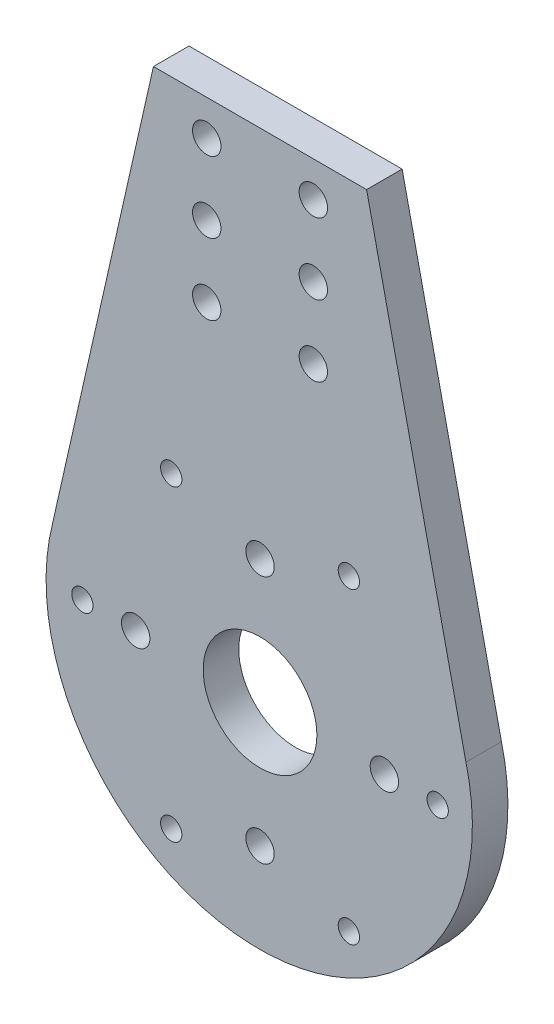
ISO-10303-21;
HEADER;
FILE_DESCRIPTION(('STEP AP214'),'2;1');
FILE_NAME('part.step','',(''),(''),'','','');
FILE_SCHEMA(('AUTOMOTIVE_DESIGN { 1 0 10303 214 1 1 1 1 }'));
ENDSEC;
DATA;
#1=APPLICATION_CONTEXT('core data for automotive mechanical design processes');
#2=APPLICATION_PROTOCOL_DEFINITION('international standard','automotive_design',2000,#1);
#3=PRODUCT_CONTEXT('',#1,'mechanical');
#4=PRODUCT('Part','Part','',(#3));
#5=PRODUCT_RELATED_PRODUCT_CATEGORY('part','',(#4));
#6=PRODUCT_DEFINITION_FORMATION('','',#4);
#7=PRODUCT_DEFINITION_CONTEXT('part definition',#1,'design');
#8=PRODUCT_DEFINITION('design','',#6,#7);
#9=PRODUCT_DEFINITION_SHAPE('','',#8);
#10=(LENGTH_UNIT() NAMED_UNIT(*) SI_UNIT(.MILLI.,.METRE.));
#11=(NAMED_UNIT(*) PLANE_ANGLE_UNIT() SI_UNIT($,.RADIAN.));
#12=(NAMED_UNIT(*) SI_UNIT($,.STERADIAN.) SOLID_ANGLE_UNIT());
#13=UNCERTAINTY_MEASURE_WITH_UNIT(LENGTH_MEASURE(1.E-05),#10,'distance_accuracy_value','');
#14=(GEOMETRIC_REPRESENTATION_CONTEXT(3) GLOBAL_UNCERTAINTY_ASSIGNED_CONTEXT((#13)) GLOBAL_UNIT_ASSIGNED_CONTEXT((#10,
#11,#12)) REPRESENTATION_CONTEXT('',''));
#15=CARTESIAN_POINT('',(0.,0.,0.));
#16=DIRECTION('',(0.,0.,1.));
#17=DIRECTION('',(1.,0.,0.));
#18=AXIS2_PLACEMENT_3D('',#15,#16,#17);
#19=CARTESIAN_POINT('',(-29.3302083690951,6.63290634270247,5.));
#20=DIRECTION('',(0.975369816698412,-0.220575884161679,0.));
#21=DIRECTION('',(0.220575884161679,0.975369816698412,0.));
#22=AXIS2_PLACEMENT_3D('',#19,#20,#21);
#23=PLANE('',#22);
#24=DIRECTION('',(-0.220575884161679,-0.975369816698412,0.));
#25=VECTOR('',#24,1.);
#26=CARTESIAN_POINT('',(-29.3302083690951,6.63290634270247,0.));
#27=LINE('',#26,#25);
#28=CARTESIAN_POINT('',(-15.,70.,0.));
#29=VERTEX_POINT('',#28);
#30=CARTESIAN_POINT('',(-29.2030837399599,7.1950418031983,0.));
#31=VERTEX_POINT('',#30);
#32=EDGE_CURVE('E152',#29,#31,#27,.T.);
#33=ORIENTED_EDGE('',*,*,#32,.T.);
#34=DIRECTION('',(0.,0.,-1.));
#35=VECTOR('',#34,1.);
#36=CARTESIAN_POINT('',(-29.2030837399599,7.1950418031983,5.));
#37=LINE('',#36,#35);
#38=CARTESIAN_POINT('',(-29.2030837399599,7.1950418031983,5.));
#39=VERTEX_POINT('',#38);
#40=EDGE_CURVE('E11',#39,#31,#37,.T.);
#41=ORIENTED_EDGE('',*,*,#40,.F.);
#42=DIRECTION('',(-0.220575884161679,-0.975369816698412,0.));
#43=VECTOR('',#42,1.);
#44=CARTESIAN_POINT('',(-29.3302083690951,6.63290634270247,5.));
#45=LINE('',#44,#43);
#46=CARTESIAN_POINT('',(-15.,70.,5.));
#47=VERTEX_POINT('',#46);
#48=EDGE_CURVE('E87',#47,#39,#45,.T.);
#49=ORIENTED_EDGE('',*,*,#48,.F.);
#50=DIRECTION('',(0.,0.,-1.));
#51=VECTOR('',#50,1.);
#52=CARTESIAN_POINT('',(-15.,70.,5.));
#53=LINE('',#52,#51);
#54=EDGE_CURVE('E53',#47,#29,#53,.T.);
#55=ORIENTED_EDGE('',*,*,#54,.T.);
#56=EDGE_LOOP('',(#33,#41,#49,#55));
#57=FACE_BOUND('',#56,.T.);
#58=ADVANCED_FACE('F37',(#57),#23,.F.);
#59=CARTESIAN_POINT('',(-0.11273470883566,-0.136506003872943,5.));
#60=DIRECTION('',(0.,0.,-1.));
#61=DIRECTION('',(-1.,0.,0.));
#62=AXIS2_PLACEMENT_3D('',#59,#60,#61);
#63=CYLINDRICAL_SURFACE('',#62,30.);
#64=CARTESIAN_POINT('',(-0.11273470883566,-0.136506003872943,0.));
#65=DIRECTION('',(0.,0.,1.));
#66=DIRECTION('',(1.,0.,0.));
#67=AXIS2_PLACEMENT_3D('',#64,#65,#66);
#68=CIRCLE('',#67,30.);
#69=CARTESIAN_POINT('',(28.9776143222885,7.1950418031983,0.));
#70=VERTEX_POINT('',#69);
#71=EDGE_CURVE('E92',#31,#70,#68,.T.);
#72=ORIENTED_EDGE('',*,*,#71,.T.);
#73=DIRECTION('',(0.,0.,-1.));
#74=VECTOR('',#73,1.);
#75=CARTESIAN_POINT('',(28.9776143222885,7.1950418031983,5.));
#76=LINE('',#75,#74);
#77=CARTESIAN_POINT('',(28.9776143222885,7.1950418031983,5.));
#78=VERTEX_POINT('',#77);
#79=EDGE_CURVE('E45',#78,#70,#76,.T.);
#80=ORIENTED_EDGE('',*,*,#79,.F.);
#81=CARTESIAN_POINT('',(-0.11273470883566,-0.136506003872943,5.));
#82=DIRECTION('',(0.,0.,1.));
#83=DIRECTION('',(1.,0.,0.));
#84=AXIS2_PLACEMENT_3D('',#81,#82,#83);
#85=CIRCLE('',#84,30.);
#86=EDGE_CURVE('E78',#39,#78,#85,.T.);
#87=ORIENTED_EDGE('',*,*,#86,.F.);
#88=ORIENTED_EDGE('',*,*,#40,.T.);
#89=EDGE_LOOP('',(#72,#80,#87,#88));
#90=FACE_BOUND('',#89,.T.);
#91=ADVANCED_FACE('F91',(#90),#63,.T.);
#92=CARTESIAN_POINT('',(29.1357849827705,6.48434100043762,5.));
#93=DIRECTION('',(0.976118036116227,0.217240833106026,0.));
#94=DIRECTION('',(-0.217240833106026,0.976118036116227,0.));
#95=AXIS2_PLACEMENT_3D('',#92,#93,#94);
#96=PLANE('',#95);
#97=DIRECTION('',(0.217240833106026,-0.976118036116227,0.));
#98=VECTOR('',#97,1.);
#99=CARTESIAN_POINT('',(29.1357849827705,6.48434100043762,0.));
#100=LINE('',#99,#98);
#101=CARTESIAN_POINT('',(15.,70.,0.));
#102=VERTEX_POINT('',#101);
#103=EDGE_CURVE('E155',#102,#70,#100,.T.);
#104=ORIENTED_EDGE('',*,*,#103,.F.);
#105=DIRECTION('',(0.,0.,-1.));
#106=VECTOR('',#105,1.);
#107=CARTESIAN_POINT('',(15.,70.,5.));
#108=LINE('',#107,#106);
#109=CARTESIAN_POINT('',(15.,70.,5.));
#110=VERTEX_POINT('',#109);
#111=EDGE_CURVE('E67',#110,#102,#108,.T.);
#112=ORIENTED_EDGE('',*,*,#111,.F.);
#113=DIRECTION('',(0.217240833106026,-0.976118036116227,0.));
#114=VECTOR('',#113,1.);
#115=CARTESIAN_POINT('',(29.1357849827705,6.48434100043762,5.));
#116=LINE('',#115,#114);
#117=EDGE_CURVE('E86',#110,#78,#116,.T.);
#118=ORIENTED_EDGE('',*,*,#117,.T.);
#119=ORIENTED_EDGE('',*,*,#79,.T.);
#120=EDGE_LOOP('',(#104,#112,#118,#119));
#121=FACE_BOUND('',#120,.T.);
#122=ADVANCED_FACE('F95',(#121),#96,.T.);
#123=CARTESIAN_POINT('',(12.4999999999999,21.650635094611,5.));
#124=DIRECTION('',(0.,0.,-1.));
#125=DIRECTION('',(-1.,0.,0.));
#126=AXIS2_PLACEMENT_3D('',#123,#124,#125);
#127=CYLINDRICAL_SURFACE('',#126,1.5);
#128=CARTESIAN_POINT('',(12.4999999999999,21.650635094611,5.));
#129=DIRECTION('',(0.,0.,1.));
#130=DIRECTION('',(1.,0.,0.));
#131=AXIS2_PLACEMENT_3D('',#128,#129,#130);
#132=CIRCLE('',#131,1.5);
#133=CARTESIAN_POINT('',(14.,21.650635094611,5.));
#134=VERTEX_POINT('',#133);
#135=EDGE_CURVE('E146',#134,#134,#132,.T.);
#136=ORIENTED_EDGE('',*,*,#135,.T.);
#137=EDGE_LOOP('',(#136));
#138=FACE_BOUND('',#137,.T.);
#139=CARTESIAN_POINT('',(12.4999999999999,21.650635094611,0.));
#140=DIRECTION('',(0.,0.,1.));
#141=DIRECTION('',(1.,0.,0.));
#142=AXIS2_PLACEMENT_3D('',#139,#140,#141);
#143=CIRCLE('',#142,1.5);
#144=CARTESIAN_POINT('',(14.,21.650635094611,0.));
#145=VERTEX_POINT('',#144);
#146=EDGE_CURVE('E205',#145,#145,#143,.T.);
#147=ORIENTED_EDGE('',*,*,#146,.F.);
#148=EDGE_LOOP('',(#147));
#149=FACE_BOUND('',#148,.T.);
#150=ADVANCED_FACE('F269',(#138,#149),#127,.F.);
#151=CARTESIAN_POINT('',(-12.5000000000001,21.6506350946109,5.));
#152=DIRECTION('',(0.,0.,-1.));
#153=DIRECTION('',(-1.,0.,0.));
#154=AXIS2_PLACEMENT_3D('',#151,#152,#153);
#155=CYLINDRICAL_SURFACE('',#154,1.5);
#156=CARTESIAN_POINT('',(-12.5000000000001,21.6506350946109,5.));
#157=DIRECTION('',(0.,0.,1.));
#158=DIRECTION('',(1.,0.,0.));
#159=AXIS2_PLACEMENT_3D('',#156,#157,#158);
#160=CIRCLE('',#159,1.5);
#161=CARTESIAN_POINT('',(-11.0000000000001,21.6506350946109,5.));
#162=VERTEX_POINT('',#161);
#163=EDGE_CURVE('E143',#162,#162,#160,.T.);
#164=ORIENTED_EDGE('',*,*,#163,.T.);
#165=EDGE_LOOP('',(#164));
#166=FACE_BOUND('',#165,.T.);
#167=CARTESIAN_POINT('',(-12.5000000000001,21.6506350946109,0.));
#168=DIRECTION('',(0.,0.,1.));
#169=DIRECTION('',(1.,0.,0.));
#170=AXIS2_PLACEMENT_3D('',#167,#168,#169);
#171=CIRCLE('',#170,1.5);
#172=CARTESIAN_POINT('',(-11.0000000000001,21.6506350946109,0.));
#173=VERTEX_POINT('',#172);
#174=EDGE_CURVE('E202',#173,#173,#171,.T.);
#175=ORIENTED_EDGE('',*,*,#174,.F.);
#176=EDGE_LOOP('',(#175));
#177=FACE_BOUND('',#176,.T.);
#178=ADVANCED_FACE('F271',(#166,#177),#155,.F.);
#179=CARTESIAN_POINT('',(-25.,0.,5.));
#180=DIRECTION('',(0.,0.,-1.));
#181=DIRECTION('',(-1.,0.,0.));
#182=AXIS2_PLACEMENT_3D('',#179,#180,#181);
#183=CYLINDRICAL_SURFACE('',#182,1.5);
#184=CARTESIAN_POINT('',(-25.,0.,5.));
#185=DIRECTION('',(0.,0.,1.));
#186=DIRECTION('',(1.,0.,0.));
#187=AXIS2_PLACEMENT_3D('',#184,#185,#186);
#188=CIRCLE('',#187,1.5);
#189=CARTESIAN_POINT('',(-23.5,0.,5.));
#190=VERTEX_POINT('',#189);
#191=EDGE_CURVE('E140',#190,#190,#188,.T.);
#192=ORIENTED_EDGE('',*,*,#191,.T.);
#193=EDGE_LOOP('',(#192));
#194=FACE_BOUND('',#193,.T.);
#195=CARTESIAN_POINT('',(-25.,0.,0.));
#196=DIRECTION('',(0.,0.,1.));
#197=DIRECTION('',(1.,0.,0.));
#198=AXIS2_PLACEMENT_3D('',#195,#196,#197);
#199=CIRCLE('',#198,1.5);
#200=CARTESIAN_POINT('',(-23.5,0.,0.));
#201=VERTEX_POINT('',#200);
#202=EDGE_CURVE('E199',#201,#201,#199,.T.);
#203=ORIENTED_EDGE('',*,*,#202,.F.);
#204=EDGE_LOOP('',(#203));
#205=FACE_BOUND('',#204,.T.);
#206=ADVANCED_FACE('F277',(#194,#205),#183,.F.);
#207=CARTESIAN_POINT('',(-12.4999999999999,-21.650635094611,5.));
#208=DIRECTION('',(0.,0.,-1.));
#209=DIRECTION('',(-1.,0.,0.));
#210=AXIS2_PLACEMENT_3D('',#207,#208,#209);
#211=CYLINDRICAL_SURFACE('',#210,1.5);
#212=CARTESIAN_POINT('',(-12.4999999999999,-21.650635094611,5.));
#213=DIRECTION('',(0.,0.,1.));
#214=DIRECTION('',(1.,0.,0.));
#215=AXIS2_PLACEMENT_3D('',#212,#213,#214);
#216=CIRCLE('',#215,1.5);
#217=CARTESIAN_POINT('',(-10.9999999999999,-21.650635094611,5.));
#218=VERTEX_POINT('',#217);
#219=EDGE_CURVE('E137',#218,#218,#216,.T.);
#220=ORIENTED_EDGE('',*,*,#219,.T.);
#221=EDGE_LOOP('',(#220));
#222=FACE_BOUND('',#221,.T.);
#223=CARTESIAN_POINT('',(-12.4999999999999,-21.650635094611,0.));
#224=DIRECTION('',(0.,0.,1.));
#225=DIRECTION('',(1.,0.,0.));
#226=AXIS2_PLACEMENT_3D('',#223,#224,#225);
#227=CIRCLE('',#226,1.5);
#228=CARTESIAN_POINT('',(-10.9999999999999,-21.650635094611,0.));
#229=VERTEX_POINT('',#228);
#230=EDGE_CURVE('E196',#229,#229,#227,.T.);
#231=ORIENTED_EDGE('',*,*,#230,.F.);
#232=EDGE_LOOP('',(#231));
#233=FACE_BOUND('',#232,.T.);
#234=ADVANCED_FACE('F284',(#222,#233),#211,.F.);
#235=CARTESIAN_POINT('',(12.5000000000001,-21.6506350946109,5.));
#236=DIRECTION('',(0.,0.,-1.));
#237=DIRECTION('',(-1.,0.,0.));
#238=AXIS2_PLACEMENT_3D('',#235,#236,#237);
#239=CYLINDRICAL_SURFACE('',#238,1.5);
#240=CARTESIAN_POINT('',(12.5000000000001,-21.6506350946109,5.));
#241=DIRECTION('',(0.,0.,1.));
#242=DIRECTION('',(1.,0.,0.));
#243=AXIS2_PLACEMENT_3D('',#240,#241,#242);
#244=CIRCLE('',#243,1.5);
#245=CARTESIAN_POINT('',(14.0000000000001,-21.6506350946109,5.));
#246=VERTEX_POINT('',#245);
#247=EDGE_CURVE('E134',#246,#246,#244,.T.);
#248=ORIENTED_EDGE('',*,*,#247,.T.);
#249=EDGE_LOOP('',(#248));
#250=FACE_BOUND('',#249,.T.);
#251=CARTESIAN_POINT('',(12.5000000000001,-21.6506350946109,0.));
#252=DIRECTION('',(0.,0.,1.));
#253=DIRECTION('',(1.,0.,0.));
#254=AXIS2_PLACEMENT_3D('',#251,#252,#253);
#255=CIRCLE('',#254,1.5);
#256=CARTESIAN_POINT('',(14.0000000000001,-21.6506350946109,0.));
#257=VERTEX_POINT('',#256);
#258=EDGE_CURVE('E193',#257,#257,#255,.T.);
#259=ORIENTED_EDGE('',*,*,#258,.F.);
#260=EDGE_LOOP('',(#259));
#261=FACE_BOUND('',#260,.T.);
#262=ADVANCED_FACE('F288',(#250,#261),#239,.F.);
#263=CARTESIAN_POINT('',(0.,0.,5.));
#264=DIRECTION('',(0.,0.,-1.));
#265=DIRECTION('',(-1.,0.,0.));
#266=AXIS2_PLACEMENT_3D('',#263,#264,#265);
#267=CYLINDRICAL_SURFACE('',#266,8.);
#268=CARTESIAN_POINT('',(0.,0.,5.));
#269=DIRECTION('',(0.,0.,1.));
#270=DIRECTION('',(1.,0.,0.));
#271=AXIS2_PLACEMENT_3D('',#268,#269,#270);
#272=CIRCLE('',#271,8.);
#273=CARTESIAN_POINT('',(8.,0.,5.));
#274=VERTEX_POINT('',#273);
#275=EDGE_CURVE('E131',#274,#274,#272,.T.);
#276=ORIENTED_EDGE('',*,*,#275,.T.);
#277=EDGE_LOOP('',(#276));
#278=FACE_BOUND('',#277,.T.);
#279=CARTESIAN_POINT('',(0.,0.,0.));
#280=DIRECTION('',(0.,0.,1.));
#281=DIRECTION('',(1.,0.,0.));
#282=AXIS2_PLACEMENT_3D('',#279,#280,#281);
#283=CIRCLE('',#282,8.);
#284=CARTESIAN_POINT('',(8.,0.,0.));
#285=VERTEX_POINT('',#284);
#286=EDGE_CURVE('E190',#285,#285,#283,.T.);
#287=ORIENTED_EDGE('',*,*,#286,.F.);
#288=EDGE_LOOP('',(#287));
#289=FACE_BOUND('',#288,.T.);
#290=ADVANCED_FACE('F292',(#278,#289),#267,.F.);
#291=CARTESIAN_POINT('',(0.,17.5,5.));
#292=DIRECTION('',(0.,0.,-1.));
#293=DIRECTION('',(-1.,0.,0.));
#294=AXIS2_PLACEMENT_3D('',#291,#292,#293);
#295=CYLINDRICAL_SURFACE('',#294,2.);
#296=CARTESIAN_POINT('',(0.,17.5,5.));
#297=DIRECTION('',(0.,0.,1.));
#298=DIRECTION('',(1.,0.,0.));
#299=AXIS2_PLACEMENT_3D('',#296,#297,#298);
#300=CIRCLE('',#299,2.);
#301=CARTESIAN_POINT('',(2.,17.5,5.));
#302=VERTEX_POINT('',#301);
#303=EDGE_CURVE('E128',#302,#302,#300,.T.);
#304=ORIENTED_EDGE('',*,*,#303,.T.);
#305=EDGE_LOOP('',(#304));
#306=FACE_BOUND('',#305,.T.);
#307=CARTESIAN_POINT('',(0.,17.5,0.));
#308=DIRECTION('',(0.,0.,1.));
#309=DIRECTION('',(1.,0.,0.));
#310=AXIS2_PLACEMENT_3D('',#307,#308,#309);
#311=CIRCLE('',#310,2.);
#312=CARTESIAN_POINT('',(2.,17.5,0.));
#313=VERTEX_POINT('',#312);
#314=EDGE_CURVE('E187',#313,#313,#311,.T.);
#315=ORIENTED_EDGE('',*,*,#314,.F.);
#316=EDGE_LOOP('',(#315));
#317=FACE_BOUND('',#316,.T.);
#318=ADVANCED_FACE('F296',(#306,#317),#295,.F.);
#319=CARTESIAN_POINT('',(17.5,0.,5.));
#320=DIRECTION('',(0.,0.,-1.));
#321=DIRECTION('',(-1.,0.,0.));
#322=AXIS2_PLACEMENT_3D('',#319,#320,#321);
#323=CYLINDRICAL_SURFACE('',#322,2.);
#324=CARTESIAN_POINT('',(17.5,0.,5.));
#325=DIRECTION('',(0.,0.,1.));
#326=DIRECTION('',(1.,0.,0.));
#327=AXIS2_PLACEMENT_3D('',#324,#325,#326);
#328=CIRCLE('',#327,2.);
#329=CARTESIAN_POINT('',(19.5,0.,5.));
#330=VERTEX_POINT('',#329);
#331=EDGE_CURVE('E125',#330,#330,#328,.T.);
#332=ORIENTED_EDGE('',*,*,#331,.T.);
#333=EDGE_LOOP('',(#332));
#334=FACE_BOUND('',#333,.T.);
#335=CARTESIAN_POINT('',(17.5,0.,0.));
#336=DIRECTION('',(0.,0.,1.));
#337=DIRECTION('',(1.,0.,0.));
#338=AXIS2_PLACEMENT_3D('',#335,#336,#337);
#339=CIRCLE('',#338,2.);
#340=CARTESIAN_POINT('',(19.5,0.,0.));
#341=VERTEX_POINT('',#340);
#342=EDGE_CURVE('E184',#341,#341,#339,.T.);
#343=ORIENTED_EDGE('',*,*,#342,.F.);
#344=EDGE_LOOP('',(#343));
#345=FACE_BOUND('',#344,.T.);
#346=ADVANCED_FACE('F300',(#334,#345),#323,.F.);
#347=CARTESIAN_POINT('',(0.,-17.5,5.));
#348=DIRECTION('',(0.,0.,-1.));
#349=DIRECTION('',(-1.,0.,0.));
#350=AXIS2_PLACEMENT_3D('',#347,#348,#349);
#351=CYLINDRICAL_SURFACE('',#350,2.);
#352=CARTESIAN_POINT('',(0.,-17.5,5.));
#353=DIRECTION('',(0.,0.,1.));
#354=DIRECTION('',(1.,0.,0.));
#355=AXIS2_PLACEMENT_3D('',#352,#353,#354);
#356=CIRCLE('',#355,2.);
#357=CARTESIAN_POINT('',(2.,-17.5,5.));
#358=VERTEX_POINT('',#357);
#359=EDGE_CURVE('E122',#358,#358,#356,.T.);
#360=ORIENTED_EDGE('',*,*,#359,.T.);
#361=EDGE_LOOP('',(#360));
#362=FACE_BOUND('',#361,.T.);
#363=CARTESIAN_POINT('',(0.,-17.5,0.));
#364=DIRECTION('',(0.,0.,1.));
#365=DIRECTION('',(1.,0.,0.));
#366=AXIS2_PLACEMENT_3D('',#363,#364,#365);
#367=CIRCLE('',#366,2.);
#368=CARTESIAN_POINT('',(2.,-17.5,0.));
#369=VERTEX_POINT('',#368);
#370=EDGE_CURVE('E181',#369,#369,#367,.T.);
#371=ORIENTED_EDGE('',*,*,#370,.F.);
#372=EDGE_LOOP('',(#371));
#373=FACE_BOUND('',#372,.T.);
#374=ADVANCED_FACE('F304',(#362,#373),#351,.F.);
#375=CARTESIAN_POINT('',(-17.5,0.,5.));
#376=DIRECTION('',(0.,0.,-1.));
#377=DIRECTION('',(-1.,0.,0.));
#378=AXIS2_PLACEMENT_3D('',#375,#376,#377);
#379=CYLINDRICAL_SURFACE('',#378,2.);
#380=CARTESIAN_POINT('',(-17.5,0.,5.));
#381=DIRECTION('',(0.,0.,1.));
#382=DIRECTION('',(1.,0.,0.));
#383=AXIS2_PLACEMENT_3D('',#380,#381,#382);
#384=CIRCLE('',#383,2.);
#385=CARTESIAN_POINT('',(-15.5,0.,5.));
#386=VERTEX_POINT('',#385);
#387=EDGE_CURVE('E119',#386,#386,#384,.T.);
#388=ORIENTED_EDGE('',*,*,#387,.T.);
#389=EDGE_LOOP('',(#388));
#390=FACE_BOUND('',#389,.T.);
#391=CARTESIAN_POINT('',(-17.5,0.,0.));
#392=DIRECTION('',(0.,0.,1.));
#393=DIRECTION('',(1.,0.,0.));
#394=AXIS2_PLACEMENT_3D('',#391,#392,#393);
#395=CIRCLE('',#394,2.);
#396=CARTESIAN_POINT('',(-15.5,0.,0.));
#397=VERTEX_POINT('',#396);
#398=EDGE_CURVE('E178',#397,#397,#395,.T.);
#399=ORIENTED_EDGE('',*,*,#398,.F.);
#400=EDGE_LOOP('',(#399));
#401=FACE_BOUND('',#400,.T.);
#402=ADVANCED_FACE('F308',(#390,#401),#379,.F.);
#403=CARTESIAN_POINT('',(7.5,45.,5.));
#404=DIRECTION('',(0.,0.,-1.));
#405=DIRECTION('',(-1.,0.,0.));
#406=AXIS2_PLACEMENT_3D('',#403,#404,#405);
#407=CYLINDRICAL_SURFACE('',#406,2.);
#408=CARTESIAN_POINT('',(7.5,45.,5.));
#409=DIRECTION('',(0.,0.,1.));
#410=DIRECTION('',(1.,0.,0.));
#411=AXIS2_PLACEMENT_3D('',#408,#409,#410);
#412=CIRCLE('',#411,2.);
#413=CARTESIAN_POINT('',(9.5,45.,5.));
#414=VERTEX_POINT('',#413);
#415=EDGE_CURVE('E116',#414,#414,#412,.T.);
#416=ORIENTED_EDGE('',*,*,#415,.T.);
#417=EDGE_LOOP('',(#416));
#418=FACE_BOUND('',#417,.T.);
#419=CARTESIAN_POINT('',(7.5,45.,0.));
#420=DIRECTION('',(0.,0.,1.));
#421=DIRECTION('',(1.,0.,0.));
#422=AXIS2_PLACEMENT_3D('',#419,#420,#421);
#423=CIRCLE('',#422,2.);
#424=CARTESIAN_POINT('',(9.5,45.,0.));
#425=VERTEX_POINT('',#424);
#426=EDGE_CURVE('E175',#425,#425,#423,.T.);
#427=ORIENTED_EDGE('',*,*,#426,.F.);
#428=EDGE_LOOP('',(#427));
#429=FACE_BOUND('',#428,.T.);
#430=ADVANCED_FACE('F312',(#418,#429),#407,.F.);
#431=CARTESIAN_POINT('',(-7.5,45.,5.));
#432=DIRECTION('',(0.,0.,-1.));
#433=DIRECTION('',(-1.,0.,0.));
#434=AXIS2_PLACEMENT_3D('',#431,#432,#433);
#435=CYLINDRICAL_SURFACE('',#434,2.);
#436=CARTESIAN_POINT('',(-7.5,45.,5.));
#437=DIRECTION('',(0.,0.,1.));
#438=DIRECTION('',(1.,0.,0.));
#439=AXIS2_PLACEMENT_3D('',#436,#437,#438);
#440=CIRCLE('',#439,2.);
#441=CARTESIAN_POINT('',(-5.5,45.,5.));
#442=VERTEX_POINT('',#441);
#443=EDGE_CURVE('E113',#442,#442,#440,.T.);
#444=ORIENTED_EDGE('',*,*,#443,.T.);
#445=EDGE_LOOP('',(#444));
#446=FACE_BOUND('',#445,.T.);
#447=CARTESIAN_POINT('',(-7.5,45.,0.));
#448=DIRECTION('',(0.,0.,1.));
#449=DIRECTION('',(1.,0.,0.));
#450=AXIS2_PLACEMENT_3D('',#447,#448,#449);
#451=CIRCLE('',#450,2.);
#452=CARTESIAN_POINT('',(-5.5,45.,0.));
#453=VERTEX_POINT('',#452);
#454=EDGE_CURVE('E172',#453,#453,#451,.T.);
#455=ORIENTED_EDGE('',*,*,#454,.F.);
#456=EDGE_LOOP('',(#455));
#457=FACE_BOUND('',#456,.T.);
#458=ADVANCED_FACE('F316',(#446,#457),#435,.F.);
#459=CARTESIAN_POINT('',(-7.5,55.,5.));
#460=DIRECTION('',(0.,0.,-1.));
#461=DIRECTION('',(-1.,0.,0.));
#462=AXIS2_PLACEMENT_3D('',#459,#460,#461);
#463=CYLINDRICAL_SURFACE('',#462,2.);
#464=CARTESIAN_POINT('',(-7.5,55.,5.));
#465=DIRECTION('',(0.,0.,1.));
#466=DIRECTION('',(1.,0.,0.));
#467=AXIS2_PLACEMENT_3D('',#464,#465,#466);
#468=CIRCLE('',#467,2.);
#469=CARTESIAN_POINT('',(-5.5,55.,5.));
#470=VERTEX_POINT('',#469);
#471=EDGE_CURVE('E110',#470,#470,#468,.T.);
#472=ORIENTED_EDGE('',*,*,#471,.T.);
#473=EDGE_LOOP('',(#472));
#474=FACE_BOUND('',#473,.T.);
#475=CARTESIAN_POINT('',(-7.5,55.,0.));
#476=DIRECTION('',(0.,0.,1.));
#477=DIRECTION('',(1.,0.,0.));
#478=AXIS2_PLACEMENT_3D('',#475,#476,#477);
#479=CIRCLE('',#478,2.);
#480=CARTESIAN_POINT('',(-5.5,55.,0.));
#481=VERTEX_POINT('',#480);
#482=EDGE_CURVE('E169',#481,#481,#479,.T.);
#483=ORIENTED_EDGE('',*,*,#482,.F.);
#484=EDGE_LOOP('',(#483));
#485=FACE_BOUND('',#484,.T.);
#486=ADVANCED_FACE('F320',(#474,#485),#463,.F.);
#487=CARTESIAN_POINT('',(-7.5,65.,5.));
#488=DIRECTION('',(0.,0.,-1.));
#489=DIRECTION('',(-1.,0.,0.));
#490=AXIS2_PLACEMENT_3D('',#487,#488,#489);
#491=CYLINDRICAL_SURFACE('',#490,2.);
#492=CARTESIAN_POINT('',(-7.5,65.,5.));
#493=DIRECTION('',(0.,0.,1.));
#494=DIRECTION('',(1.,0.,0.));
#495=AXIS2_PLACEMENT_3D('',#492,#493,#494);
#496=CIRCLE('',#495,2.);
#497=CARTESIAN_POINT('',(-5.5,65.,5.));
#498=VERTEX_POINT('',#497);
#499=EDGE_CURVE('E107',#498,#498,#496,.T.);
#500=ORIENTED_EDGE('',*,*,#499,.T.);
#501=EDGE_LOOP('',(#500));
#502=FACE_BOUND('',#501,.T.);
#503=CARTESIAN_POINT('',(-7.5,65.,0.));
#504=DIRECTION('',(0.,0.,1.));
#505=DIRECTION('',(1.,0.,0.));
#506=AXIS2_PLACEMENT_3D('',#503,#504,#505);
#507=CIRCLE('',#506,2.);
#508=CARTESIAN_POINT('',(-5.5,65.,0.));
#509=VERTEX_POINT('',#508);
#510=EDGE_CURVE('E166',#509,#509,#507,.T.);
#511=ORIENTED_EDGE('',*,*,#510,.F.);
#512=EDGE_LOOP('',(#511));
#513=FACE_BOUND('',#512,.T.);
#514=ADVANCED_FACE('F324',(#502,#513),#491,.F.);
#515=CARTESIAN_POINT('',(7.5,55.,5.));
#516=DIRECTION('',(0.,0.,-1.));
#517=DIRECTION('',(-1.,0.,0.));
#518=AXIS2_PLACEMENT_3D('',#515,#516,#517);
#519=CYLINDRICAL_SURFACE('',#518,2.);
#520=CARTESIAN_POINT('',(7.5,55.,5.));
#521=DIRECTION('',(0.,0.,1.));
#522=DIRECTION('',(1.,0.,0.));
#523=AXIS2_PLACEMENT_3D('',#520,#521,#522);
#524=CIRCLE('',#523,2.);
#525=CARTESIAN_POINT('',(9.5,55.,5.));
#526=VERTEX_POINT('',#525);
#527=EDGE_CURVE('E104',#526,#526,#524,.T.);
#528=ORIENTED_EDGE('',*,*,#527,.T.);
#529=EDGE_LOOP('',(#528));
#530=FACE_BOUND('',#529,.T.);
#531=CARTESIAN_POINT('',(7.5,55.,0.));
#532=DIRECTION('',(0.,0.,1.));
#533=DIRECTION('',(1.,0.,0.));
#534=AXIS2_PLACEMENT_3D('',#531,#532,#533);
#535=CIRCLE('',#534,2.);
#536=CARTESIAN_POINT('',(9.5,55.,0.));
#537=VERTEX_POINT('',#536);
#538=EDGE_CURVE('E163',#537,#537,#535,.T.);
#539=ORIENTED_EDGE('',*,*,#538,.F.);
#540=EDGE_LOOP('',(#539));
#541=FACE_BOUND('',#540,.T.);
#542=ADVANCED_FACE('F328',(#530,#541),#519,.F.);
#543=CARTESIAN_POINT('',(7.5,65.,5.));
#544=DIRECTION('',(0.,0.,-1.));
#545=DIRECTION('',(-1.,0.,0.));
#546=AXIS2_PLACEMENT_3D('',#543,#544,#545);
#547=CYLINDRICAL_SURFACE('',#546,2.);
#548=CARTESIAN_POINT('',(7.5,65.,5.));
#549=DIRECTION('',(0.,0.,1.));
#550=DIRECTION('',(1.,0.,0.));
#551=AXIS2_PLACEMENT_3D('',#548,#549,#550);
#552=CIRCLE('',#551,2.);
#553=CARTESIAN_POINT('',(9.5,65.,5.));
#554=VERTEX_POINT('',#553);
#555=EDGE_CURVE('E98',#554,#554,#552,.T.);
#556=ORIENTED_EDGE('',*,*,#555,.T.);
#557=EDGE_LOOP('',(#556));
#558=FACE_BOUND('',#557,.T.);
#559=CARTESIAN_POINT('',(7.5,65.,0.));
#560=DIRECTION('',(0.,0.,1.));
#561=DIRECTION('',(1.,0.,0.));
#562=AXIS2_PLACEMENT_3D('',#559,#560,#561);
#563=CIRCLE('',#562,2.);
#564=CARTESIAN_POINT('',(9.5,65.,0.));
#565=VERTEX_POINT('',#564);
#566=EDGE_CURVE('E160',#565,#565,#563,.T.);
#567=ORIENTED_EDGE('',*,*,#566,.F.);
#568=EDGE_LOOP('',(#567));
#569=FACE_BOUND('',#568,.T.);
#570=ADVANCED_FACE('F226',(#558,#569),#547,.F.);
#571=CARTESIAN_POINT('',(0.,70.,5.));
#572=DIRECTION('',(0.,1.,0.));
#573=DIRECTION('',(0.,0.,1.));
#574=AXIS2_PLACEMENT_3D('',#571,#572,#573);
#575=PLANE('',#574);
#576=DIRECTION('',(1.,0.,0.));
#577=VECTOR('',#576,1.);
#578=CARTESIAN_POINT('',(0.,70.,0.));
#579=LINE('',#578,#577);
#580=EDGE_CURVE('E157',#29,#102,#579,.T.);
#581=ORIENTED_EDGE('',*,*,#580,.F.);
#582=ORIENTED_EDGE('',*,*,#54,.F.);
#583=DIRECTION('',(1.,0.,0.));
#584=VECTOR('',#583,1.);
#585=CARTESIAN_POINT('',(0.,70.,5.));
#586=LINE('',#585,#584);
#587=EDGE_CURVE('E96',#47,#110,#586,.T.);
#588=ORIENTED_EDGE('',*,*,#587,.T.);
#589=ORIENTED_EDGE('',*,*,#111,.T.);
#590=EDGE_LOOP('',(#581,#582,#588,#589));
#591=FACE_BOUND('',#590,.T.);
#592=ADVANCED_FACE('F218',(#591),#575,.T.);
#593=CARTESIAN_POINT('',(25.,0.,5.));
#594=DIRECTION('',(0.,0.,-1.));
#595=DIRECTION('',(-1.,0.,0.));
#596=AXIS2_PLACEMENT_3D('',#593,#594,#595);
#597=CYLINDRICAL_SURFACE('',#596,1.5);
#598=CARTESIAN_POINT('',(25.,0.,5.));
#599=DIRECTION('',(0.,0.,1.));
#600=DIRECTION('',(1.,0.,0.));
#601=AXIS2_PLACEMENT_3D('',#598,#599,#600);
#602=CIRCLE('',#601,1.5);
#603=CARTESIAN_POINT('',(26.5,0.,5.));
#604=VERTEX_POINT('',#603);
#605=EDGE_CURVE('E149',#604,#604,#602,.T.);
#606=ORIENTED_EDGE('',*,*,#605,.T.);
#607=EDGE_LOOP('',(#606));
#608=FACE_BOUND('',#607,.T.);
#609=CARTESIAN_POINT('',(25.,0.,0.));
#610=DIRECTION('',(0.,0.,1.));
#611=DIRECTION('',(1.,0.,0.));
#612=AXIS2_PLACEMENT_3D('',#609,#610,#611);
#613=CIRCLE('',#612,1.5);
#614=CARTESIAN_POINT('',(26.5,0.,0.));
#615=VERTEX_POINT('',#614);
#616=EDGE_CURVE('E208',#615,#615,#613,.T.);
#617=ORIENTED_EDGE('',*,*,#616,.F.);
#618=EDGE_LOOP('',(#617));
#619=FACE_BOUND('',#618,.T.);
#620=ADVANCED_FACE('F216',(#608,#619),#597,.F.);
#621=CARTESIAN_POINT('',(0.,0.,5.));
#622=DIRECTION('',(0.,0.,1.));
#623=DIRECTION('',(1.,0.,0.));
#624=AXIS2_PLACEMENT_3D('',#621,#622,#623);
#625=PLANE('',#624);
#626=ORIENTED_EDGE('',*,*,#48,.T.);
#627=ORIENTED_EDGE('',*,*,#86,.T.);
#628=ORIENTED_EDGE('',*,*,#117,.F.);
#629=ORIENTED_EDGE('',*,*,#587,.F.);
#630=EDGE_LOOP('',(#626,#627,#628,#629));
#631=FACE_BOUND('',#630,.T.);
#632=ORIENTED_EDGE('',*,*,#555,.F.);
#633=EDGE_LOOP('',(#632));
#634=FACE_BOUND('',#633,.T.);
#635=ORIENTED_EDGE('',*,*,#527,.F.);
#636=EDGE_LOOP('',(#635));
#637=FACE_BOUND('',#636,.T.);
#638=ORIENTED_EDGE('',*,*,#499,.F.);
#639=EDGE_LOOP('',(#638));
#640=FACE_BOUND('',#639,.T.);
#641=ORIENTED_EDGE('',*,*,#471,.F.);
#642=EDGE_LOOP('',(#641));
#643=FACE_BOUND('',#642,.T.);
#644=ORIENTED_EDGE('',*,*,#443,.F.);
#645=EDGE_LOOP('',(#644));
#646=FACE_BOUND('',#645,.T.);
#647=ORIENTED_EDGE('',*,*,#415,.F.);
#648=EDGE_LOOP('',(#647));
#649=FACE_BOUND('',#648,.T.);
#650=ORIENTED_EDGE('',*,*,#387,.F.);
#651=EDGE_LOOP('',(#650));
#652=FACE_BOUND('',#651,.T.);
#653=ORIENTED_EDGE('',*,*,#359,.F.);
#654=EDGE_LOOP('',(#653));
#655=FACE_BOUND('',#654,.T.);
#656=ORIENTED_EDGE('',*,*,#331,.F.);
#657=EDGE_LOOP('',(#656));
#658=FACE_BOUND('',#657,.T.);
#659=ORIENTED_EDGE('',*,*,#303,.F.);
#660=EDGE_LOOP('',(#659));
#661=FACE_BOUND('',#660,.T.);
#662=ORIENTED_EDGE('',*,*,#275,.F.);
#663=EDGE_LOOP('',(#662));
#664=FACE_BOUND('',#663,.T.);
#665=ORIENTED_EDGE('',*,*,#247,.F.);
#666=EDGE_LOOP('',(#665));
#667=FACE_BOUND('',#666,.T.);
#668=ORIENTED_EDGE('',*,*,#219,.F.);
#669=EDGE_LOOP('',(#668));
#670=FACE_BOUND('',#669,.T.);
#671=ORIENTED_EDGE('',*,*,#191,.F.);
#672=EDGE_LOOP('',(#671));
#673=FACE_BOUND('',#672,.T.);
#674=ORIENTED_EDGE('',*,*,#163,.F.);
#675=EDGE_LOOP('',(#674));
#676=FACE_BOUND('',#675,.T.);
#677=ORIENTED_EDGE('',*,*,#135,.F.);
#678=EDGE_LOOP('',(#677));
#679=FACE_BOUND('',#678,.T.);
#680=ORIENTED_EDGE('',*,*,#605,.F.);
#681=EDGE_LOOP('',(#680));
#682=FACE_BOUND('',#681,.T.);
#683=ADVANCED_FACE('F82',(#631,#634,#637,#640,#643,#646,#649,#652,#655,#658,#661,#664,#667,#670,
#673,#676,#679,#682),#625,.T.);
#684=CARTESIAN_POINT('',(0.,0.,0.));
#685=DIRECTION('',(0.,0.,1.));
#686=DIRECTION('',(1.,0.,0.));
#687=AXIS2_PLACEMENT_3D('',#684,#685,#686);
#688=PLANE('',#687);
#689=ORIENTED_EDGE('',*,*,#32,.F.);
#690=ORIENTED_EDGE('',*,*,#580,.T.);
#691=ORIENTED_EDGE('',*,*,#103,.T.);
#692=ORIENTED_EDGE('',*,*,#71,.F.);
#693=EDGE_LOOP('',(#689,#690,#691,#692));
#694=FACE_BOUND('',#693,.T.);
#695=ORIENTED_EDGE('',*,*,#566,.T.);
#696=EDGE_LOOP('',(#695));
#697=FACE_BOUND('',#696,.T.);
#698=ORIENTED_EDGE('',*,*,#538,.T.);
#699=EDGE_LOOP('',(#698));
#700=FACE_BOUND('',#699,.T.);
#701=ORIENTED_EDGE('',*,*,#510,.T.);
#702=EDGE_LOOP('',(#701));
#703=FACE_BOUND('',#702,.T.);
#704=ORIENTED_EDGE('',*,*,#482,.T.);
#705=EDGE_LOOP('',(#704));
#706=FACE_BOUND('',#705,.T.);
#707=ORIENTED_EDGE('',*,*,#454,.T.);
#708=EDGE_LOOP('',(#707));
#709=FACE_BOUND('',#708,.T.);
#710=ORIENTED_EDGE('',*,*,#426,.T.);
#711=EDGE_LOOP('',(#710));
#712=FACE_BOUND('',#711,.T.);
#713=ORIENTED_EDGE('',*,*,#398,.T.);
#714=EDGE_LOOP('',(#713));
#715=FACE_BOUND('',#714,.T.);
#716=ORIENTED_EDGE('',*,*,#370,.T.);
#717=EDGE_LOOP('',(#716));
#718=FACE_BOUND('',#717,.T.);
#719=ORIENTED_EDGE('',*,*,#342,.T.);
#720=EDGE_LOOP('',(#719));
#721=FACE_BOUND('',#720,.T.);
#722=ORIENTED_EDGE('',*,*,#314,.T.);
#723=EDGE_LOOP('',(#722));
#724=FACE_BOUND('',#723,.T.);
#725=ORIENTED_EDGE('',*,*,#286,.T.);
#726=EDGE_LOOP('',(#725));
#727=FACE_BOUND('',#726,.T.);
#728=ORIENTED_EDGE('',*,*,#258,.T.);
#729=EDGE_LOOP('',(#728));
#730=FACE_BOUND('',#729,.T.);
#731=ORIENTED_EDGE('',*,*,#230,.T.);
#732=EDGE_LOOP('',(#731));
#733=FACE_BOUND('',#732,.T.);
#734=ORIENTED_EDGE('',*,*,#202,.T.);
#735=EDGE_LOOP('',(#734));
#736=FACE_BOUND('',#735,.T.);
#737=ORIENTED_EDGE('',*,*,#174,.T.);
#738=EDGE_LOOP('',(#737));
#739=FACE_BOUND('',#738,.T.);
#740=ORIENTED_EDGE('',*,*,#146,.T.);
#741=EDGE_LOOP('',(#740));
#742=FACE_BOUND('',#741,.T.);
#743=ORIENTED_EDGE('',*,*,#616,.T.);
#744=EDGE_LOOP('',(#743));
#745=FACE_BOUND('',#744,.T.);
#746=ADVANCED_FACE('F214',(#694,#697,#700,#703,#706,#709,#712,#715,#718,#721,#724,#727,#730,
#733,#736,#739,#742,#745),#688,.F.);
#747=CLOSED_SHELL('',(#58,#91,#122,#150,#178,#206,#234,#262,#290,#318,#346,#374,#402,#430,#458,
#486,#514,#542,#570,#592,#620,#683,#746));
#748=MANIFOLD_SOLID_BREP('B2',#747);
#749=ADVANCED_BREP_SHAPE_REPRESENTATION('',(#18,#748),#14);
#750=SHAPE_DEFINITION_REPRESENTATION(#9,#749);
ENDSEC;
END-ISO-10303-21;
